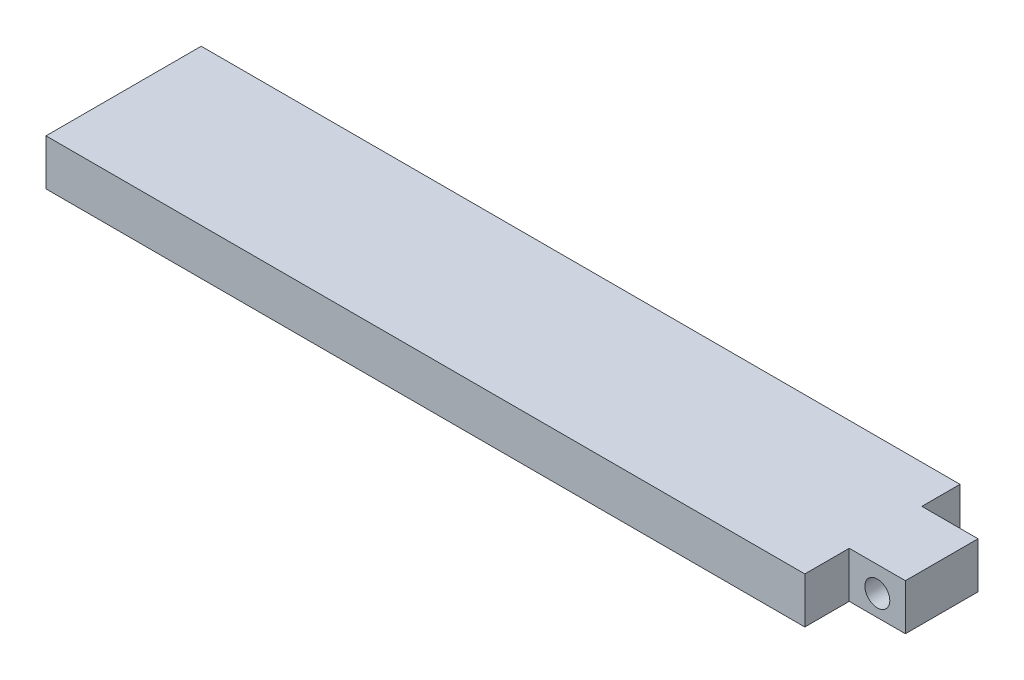
ISO-10303-21;
HEADER;
FILE_DESCRIPTION(('STEP AP214'),'2;1');
FILE_NAME('part.step','',(''),(''),'','','');
FILE_SCHEMA(('AUTOMOTIVE_DESIGN { 1 0 10303 214 1 1 1 1 }'));
ENDSEC;
DATA;
#1=APPLICATION_CONTEXT('core data for automotive mechanical design processes');
#2=APPLICATION_PROTOCOL_DEFINITION('international standard','automotive_design',2000,#1);
#3=PRODUCT_CONTEXT('',#1,'mechanical');
#4=PRODUCT('Part','Part','',(#3));
#5=PRODUCT_RELATED_PRODUCT_CATEGORY('part','',(#4));
#6=PRODUCT_DEFINITION_FORMATION('','',#4);
#7=PRODUCT_DEFINITION_CONTEXT('part definition',#1,'design');
#8=PRODUCT_DEFINITION('design','',#6,#7);
#9=PRODUCT_DEFINITION_SHAPE('','',#8);
#10=(LENGTH_UNIT() NAMED_UNIT(*) SI_UNIT(.MILLI.,.METRE.));
#11=(NAMED_UNIT(*) PLANE_ANGLE_UNIT() SI_UNIT($,.RADIAN.));
#12=(NAMED_UNIT(*) SI_UNIT($,.STERADIAN.) SOLID_ANGLE_UNIT());
#13=UNCERTAINTY_MEASURE_WITH_UNIT(LENGTH_MEASURE(1.E-05),#10,'distance_accuracy_value','');
#14=(GEOMETRIC_REPRESENTATION_CONTEXT(3) GLOBAL_UNCERTAINTY_ASSIGNED_CONTEXT((#13)) GLOBAL_UNIT_ASSIGNED_CONTEXT((#10,
#11,#12)) REPRESENTATION_CONTEXT('',''));
#15=CARTESIAN_POINT('',(0.,0.,0.));
#16=DIRECTION('',(0.,0.,1.));
#17=DIRECTION('',(1.,0.,0.));
#18=AXIS2_PLACEMENT_3D('',#15,#16,#17);
#19=CARTESIAN_POINT('',(0.,4.,-3.86426784554317));
#20=DIRECTION('',(0.,0.,-1.));
#21=DIRECTION('',(-1.,0.,0.));
#22=AXIS2_PLACEMENT_3D('',#19,#20,#21);
#23=PLANE('',#22);
#24=CARTESIAN_POINT('',(68.4348044581604,1.81723247665775,-3.86426784554317));
#25=DIRECTION('',(0.,0.,1.));
#26=DIRECTION('',(1.,0.,0.));
#27=AXIS2_PLACEMENT_3D('',#24,#25,#26);
#28=CIRCLE('',#27,1.08475397364903);
#29=CARTESIAN_POINT('',(69.5195584318094,1.81723247665775,-3.86426784554317));
#30=VERTEX_POINT('',#29);
#31=EDGE_CURVE('E179',#30,#30,#28,.T.);
#32=ORIENTED_EDGE('',*,*,#31,.F.);
#33=EDGE_LOOP('',(#32));
#34=FACE_BOUND('',#33,.T.);
#35=DIRECTION('',(1.,0.,0.));
#36=VECTOR('',#35,1.);
#37=CARTESIAN_POINT('',(0.,0.,-3.86426784554317));
#38=LINE('',#37,#36);
#39=CARTESIAN_POINT('',(65.9937267510031,0.,-3.86426784554317));
#40=VERTEX_POINT('',#39);
#41=CARTESIAN_POINT('',(70.8758821653177,0.,-3.86426784554317));
#42=VERTEX_POINT('',#41);
#43=EDGE_CURVE('E134',#40,#42,#38,.T.);
#44=ORIENTED_EDGE('',*,*,#43,.T.);
#45=DIRECTION('',(0.,-1.,0.));
#46=VECTOR('',#45,1.);
#47=CARTESIAN_POINT('',(70.8758821653177,4.,-3.86426784554317));
#48=LINE('',#47,#46);
#49=CARTESIAN_POINT('',(70.8758821653177,4.,-3.86426784554317));
#50=VERTEX_POINT('',#49);
#51=EDGE_CURVE('E11',#50,#42,#48,.T.);
#52=ORIENTED_EDGE('',*,*,#51,.F.);
#53=DIRECTION('',(1.,0.,0.));
#54=VECTOR('',#53,1.);
#55=CARTESIAN_POINT('',(0.,4.,-3.86426784554317));
#56=LINE('',#55,#54);
#57=CARTESIAN_POINT('',(65.9937267510031,4.,-3.86426784554317));
#58=VERTEX_POINT('',#57);
#59=EDGE_CURVE('E175',#58,#50,#56,.T.);
#60=ORIENTED_EDGE('',*,*,#59,.F.);
#61=DIRECTION('',(0.,-1.,0.));
#62=VECTOR('',#61,1.);
#63=CARTESIAN_POINT('',(65.9937267510031,4.,-3.86426784554317));
#64=LINE('',#63,#62);
#65=EDGE_CURVE('E52',#58,#40,#64,.T.);
#66=ORIENTED_EDGE('',*,*,#65,.T.);
#67=EDGE_LOOP('',(#44,#52,#60,#66));
#68=FACE_BOUND('',#67,.T.);
#69=ADVANCED_FACE('F35',(#34,#68),#23,.F.);
#70=CARTESIAN_POINT('',(70.8758821653177,4.,0.));
#71=DIRECTION('',(-1.,0.,0.));
#72=DIRECTION('',(0.,0.,1.));
#73=AXIS2_PLACEMENT_3D('',#70,#71,#72);
#74=PLANE('',#73);
#75=DIRECTION('',(0.,0.,-1.));
#76=VECTOR('',#75,1.);
#77=CARTESIAN_POINT('',(70.8758821653177,0.,0.));
#78=LINE('',#77,#76);
#79=CARTESIAN_POINT('',(70.8758821653177,0.,-10.1795813079235));
#80=VERTEX_POINT('',#79);
#81=EDGE_CURVE('E136',#42,#80,#78,.T.);
#82=ORIENTED_EDGE('',*,*,#81,.T.);
#83=DIRECTION('',(0.,-1.,0.));
#84=VECTOR('',#83,1.);
#85=CARTESIAN_POINT('',(70.8758821653177,4.,-10.1795813079235));
#86=LINE('',#85,#84);
#87=CARTESIAN_POINT('',(70.8758821653177,4.,-10.1795813079235));
#88=VERTEX_POINT('',#87);
#89=EDGE_CURVE('E44',#88,#80,#86,.T.);
#90=ORIENTED_EDGE('',*,*,#89,.F.);
#91=DIRECTION('',(0.,0.,-1.));
#92=VECTOR('',#91,1.);
#93=CARTESIAN_POINT('',(70.8758821653177,4.,0.));
#94=LINE('',#93,#92);
#95=EDGE_CURVE('E91',#50,#88,#94,.T.);
#96=ORIENTED_EDGE('',*,*,#95,.F.);
#97=ORIENTED_EDGE('',*,*,#51,.T.);
#98=EDGE_LOOP('',(#82,#90,#96,#97));
#99=FACE_BOUND('',#98,.T.);
#100=ADVANCED_FACE('F165',(#99),#74,.F.);
#101=CARTESIAN_POINT('',(0.,4.,-10.1795813079235));
#102=DIRECTION('',(0.,0.,-1.));
#103=DIRECTION('',(-1.,0.,0.));
#104=AXIS2_PLACEMENT_3D('',#101,#102,#103);
#105=PLANE('',#104);
#106=CARTESIAN_POINT('',(68.4348044581604,1.81723247665775,-10.1795813079235));
#107=DIRECTION('',(0.,0.,-1.));
#108=DIRECTION('',(-1.,0.,0.));
#109=AXIS2_PLACEMENT_3D('',#106,#107,#108);
#110=CIRCLE('',#109,1.08475397364903);
#111=CARTESIAN_POINT('',(67.3500504845114,1.81723247665775,-10.1795813079235));
#112=VERTEX_POINT('',#111);
#113=EDGE_CURVE('E38',#112,#112,#110,.T.);
#114=ORIENTED_EDGE('',*,*,#113,.F.);
#115=EDGE_LOOP('',(#114));
#116=FACE_BOUND('',#115,.T.);
#117=DIRECTION('',(1.,0.,0.));
#118=VECTOR('',#117,1.);
#119=CARTESIAN_POINT('',(0.,0.,-10.1795813079235));
#120=LINE('',#119,#118);
#121=CARTESIAN_POINT('',(65.9937267510031,0.,-10.1795813079235));
#122=VERTEX_POINT('',#121);
#123=EDGE_CURVE('E139',#122,#80,#120,.T.);
#124=ORIENTED_EDGE('',*,*,#123,.F.);
#125=DIRECTION('',(0.,-1.,0.));
#126=VECTOR('',#125,1.);
#127=CARTESIAN_POINT('',(65.9937267510031,4.,-10.1795813079235));
#128=LINE('',#127,#126);
#129=CARTESIAN_POINT('',(65.9937267510031,4.,-10.1795813079235));
#130=VERTEX_POINT('',#129);
#131=EDGE_CURVE('E157',#130,#122,#128,.T.);
#132=ORIENTED_EDGE('',*,*,#131,.F.);
#133=DIRECTION('',(1.,0.,0.));
#134=VECTOR('',#133,1.);
#135=CARTESIAN_POINT('',(0.,4.,-10.1795813079235));
#136=LINE('',#135,#134);
#137=EDGE_CURVE('E164',#130,#88,#136,.T.);
#138=ORIENTED_EDGE('',*,*,#137,.T.);
#139=ORIENTED_EDGE('',*,*,#89,.T.);
#140=EDGE_LOOP('',(#124,#132,#138,#139));
#141=FACE_BOUND('',#140,.T.);
#142=ADVANCED_FACE('F162',(#116,#141),#105,.T.);
#143=CARTESIAN_POINT('',(65.9937267510031,4.,0.));
#144=DIRECTION('',(1.,0.,0.));
#145=DIRECTION('',(0.,0.,-1.));
#146=AXIS2_PLACEMENT_3D('',#143,#144,#145);
#147=PLANE('',#146);
#148=DIRECTION('',(0.,0.,1.));
#149=VECTOR('',#148,1.);
#150=CARTESIAN_POINT('',(65.9937267510031,0.,0.));
#151=LINE('',#150,#149);
#152=CARTESIAN_POINT('',(65.9937267510031,0.,-13.498100823404));
#153=VERTEX_POINT('',#152);
#154=EDGE_CURVE('E142',#153,#122,#151,.T.);
#155=ORIENTED_EDGE('',*,*,#154,.F.);
#156=DIRECTION('',(0.,-1.,0.));
#157=VECTOR('',#156,1.);
#158=CARTESIAN_POINT('',(65.9937267510031,4.,-13.498100823404));
#159=LINE('',#158,#157);
#160=CARTESIAN_POINT('',(65.9937267510031,4.,-13.498100823404));
#161=VERTEX_POINT('',#160);
#162=EDGE_CURVE('E155',#161,#153,#159,.T.);
#163=ORIENTED_EDGE('',*,*,#162,.F.);
#164=DIRECTION('',(0.,0.,1.));
#165=VECTOR('',#164,1.);
#166=CARTESIAN_POINT('',(65.9937267510031,4.,0.));
#167=LINE('',#166,#165);
#168=EDGE_CURVE('E130',#161,#130,#167,.T.);
#169=ORIENTED_EDGE('',*,*,#168,.T.);
#170=ORIENTED_EDGE('',*,*,#131,.T.);
#171=EDGE_LOOP('',(#155,#163,#169,#170));
#172=FACE_BOUND('',#171,.T.);
#173=ADVANCED_FACE('F172',(#172),#147,.T.);
#174=CARTESIAN_POINT('',(0.,4.,-13.498100823404));
#175=DIRECTION('',(0.,0.,-1.));
#176=DIRECTION('',(-1.,0.,0.));
#177=AXIS2_PLACEMENT_3D('',#174,#175,#176);
#178=PLANE('',#177);
#179=DIRECTION('',(1.,0.,0.));
#180=VECTOR('',#179,1.);
#181=CARTESIAN_POINT('',(0.,0.,-13.498100823404));
#182=LINE('',#181,#180);
#183=CARTESIAN_POINT('',(0.,0.,-13.498100823404));
#184=VERTEX_POINT('',#183);
#185=EDGE_CURVE('E145',#184,#153,#182,.T.);
#186=ORIENTED_EDGE('',*,*,#185,.F.);
#187=DIRECTION('',(0.,-1.,0.));
#188=VECTOR('',#187,1.);
#189=CARTESIAN_POINT('',(0.,4.,-13.498100823404));
#190=LINE('',#189,#188);
#191=CARTESIAN_POINT('',(0.,4.,-13.498100823404));
#192=VERTEX_POINT('',#191);
#193=EDGE_CURVE('E116',#192,#184,#190,.T.);
#194=ORIENTED_EDGE('',*,*,#193,.F.);
#195=DIRECTION('',(1.,0.,0.));
#196=VECTOR('',#195,1.);
#197=CARTESIAN_POINT('',(0.,4.,-13.498100823404));
#198=LINE('',#197,#196);
#199=EDGE_CURVE('E128',#192,#161,#198,.T.);
#200=ORIENTED_EDGE('',*,*,#199,.T.);
#201=ORIENTED_EDGE('',*,*,#162,.T.);
#202=EDGE_LOOP('',(#186,#194,#200,#201));
#203=FACE_BOUND('',#202,.T.);
#204=ADVANCED_FACE('F194',(#203),#178,.T.);
#205=CARTESIAN_POINT('',(0.,4.,0.));
#206=DIRECTION('',(-1.,0.,0.));
#207=DIRECTION('',(0.,0.,1.));
#208=AXIS2_PLACEMENT_3D('',#205,#206,#207);
#209=PLANE('',#208);
#210=DIRECTION('',(0.,0.,-1.));
#211=VECTOR('',#210,1.);
#212=CARTESIAN_POINT('',(0.,0.,0.));
#213=LINE('',#212,#211);
#214=CARTESIAN_POINT('',(0.,0.,0.));
#215=VERTEX_POINT('',#214);
#216=EDGE_CURVE('E113',#215,#184,#213,.T.);
#217=ORIENTED_EDGE('',*,*,#216,.F.);
#218=DIRECTION('',(0.,-1.,0.));
#219=VECTOR('',#218,1.);
#220=CARTESIAN_POINT('',(0.,4.,0.));
#221=LINE('',#220,#219);
#222=CARTESIAN_POINT('',(0.,4.,0.));
#223=VERTEX_POINT('',#222);
#224=EDGE_CURVE('E107',#223,#215,#221,.T.);
#225=ORIENTED_EDGE('',*,*,#224,.F.);
#226=DIRECTION('',(0.,0.,-1.));
#227=VECTOR('',#226,1.);
#228=CARTESIAN_POINT('',(0.,4.,0.));
#229=LINE('',#228,#227);
#230=EDGE_CURVE('E111',#223,#192,#229,.T.);
#231=ORIENTED_EDGE('',*,*,#230,.T.);
#232=ORIENTED_EDGE('',*,*,#193,.T.);
#233=EDGE_LOOP('',(#217,#225,#231,#232));
#234=FACE_BOUND('',#233,.T.);
#235=ADVANCED_FACE('F109',(#234),#209,.T.);
#236=CARTESIAN_POINT('',(0.,4.,0.));
#237=DIRECTION('',(0.,0.,-1.));
#238=DIRECTION('',(-1.,0.,0.));
#239=AXIS2_PLACEMENT_3D('',#236,#237,#238);
#240=PLANE('',#239);
#241=DIRECTION('',(1.,0.,0.));
#242=VECTOR('',#241,1.);
#243=CARTESIAN_POINT('',(0.,0.,0.));
#244=LINE('',#243,#242);
#245=CARTESIAN_POINT('',(65.9937267510031,0.,0.));
#246=VERTEX_POINT('',#245);
#247=EDGE_CURVE('E150',#215,#246,#244,.T.);
#248=ORIENTED_EDGE('',*,*,#247,.T.);
#249=DIRECTION('',(0.,-1.,0.));
#250=VECTOR('',#249,1.);
#251=CARTESIAN_POINT('',(65.9937267510031,4.,0.));
#252=LINE('',#251,#250);
#253=CARTESIAN_POINT('',(65.9937267510031,4.,0.));
#254=VERTEX_POINT('',#253);
#255=EDGE_CURVE('E79',#254,#246,#252,.T.);
#256=ORIENTED_EDGE('',*,*,#255,.F.);
#257=DIRECTION('',(1.,0.,0.));
#258=VECTOR('',#257,1.);
#259=CARTESIAN_POINT('',(0.,4.,0.));
#260=LINE('',#259,#258);
#261=EDGE_CURVE('E118',#223,#254,#260,.T.);
#262=ORIENTED_EDGE('',*,*,#261,.F.);
#263=ORIENTED_EDGE('',*,*,#224,.T.);
#264=EDGE_LOOP('',(#248,#256,#262,#263));
#265=FACE_BOUND('',#264,.T.);
#266=ADVANCED_FACE('F119',(#265),#240,.F.);
#267=EDGE_CURVE('E146',#40,#246,#151,.T.);
#268=ORIENTED_EDGE('',*,*,#267,.F.);
#269=ORIENTED_EDGE('',*,*,#65,.F.);
#270=EDGE_CURVE('E122',#58,#254,#167,.T.);
#271=ORIENTED_EDGE('',*,*,#270,.T.);
#272=ORIENTED_EDGE('',*,*,#255,.T.);
#273=EDGE_LOOP('',(#268,#269,#271,#272));
#274=FACE_BOUND('',#273,.T.);
#275=ADVANCED_FACE('F196',(#274),#147,.T.);
#276=CARTESIAN_POINT('',(0.,4.,0.));
#277=DIRECTION('',(0.,1.,0.));
#278=DIRECTION('',(0.,0.,1.));
#279=AXIS2_PLACEMENT_3D('',#276,#277,#278);
#280=PLANE('',#279);
#281=ORIENTED_EDGE('',*,*,#59,.T.);
#282=ORIENTED_EDGE('',*,*,#95,.T.);
#283=ORIENTED_EDGE('',*,*,#137,.F.);
#284=ORIENTED_EDGE('',*,*,#168,.F.);
#285=ORIENTED_EDGE('',*,*,#199,.F.);
#286=ORIENTED_EDGE('',*,*,#230,.F.);
#287=ORIENTED_EDGE('',*,*,#261,.T.);
#288=ORIENTED_EDGE('',*,*,#270,.F.);
#289=EDGE_LOOP('',(#281,#282,#283,#284,#285,#286,#287,#288));
#290=FACE_BOUND('',#289,.T.);
#291=ADVANCED_FACE('F125',(#290),#280,.T.);
#292=CARTESIAN_POINT('',(0.,0.,0.));
#293=DIRECTION('',(0.,1.,0.));
#294=DIRECTION('',(0.,0.,1.));
#295=AXIS2_PLACEMENT_3D('',#292,#293,#294);
#296=PLANE('',#295);
#297=ORIENTED_EDGE('',*,*,#43,.F.);
#298=ORIENTED_EDGE('',*,*,#267,.T.);
#299=ORIENTED_EDGE('',*,*,#247,.F.);
#300=ORIENTED_EDGE('',*,*,#216,.T.);
#301=ORIENTED_EDGE('',*,*,#185,.T.);
#302=ORIENTED_EDGE('',*,*,#154,.T.);
#303=ORIENTED_EDGE('',*,*,#123,.T.);
#304=ORIENTED_EDGE('',*,*,#81,.F.);
#305=EDGE_LOOP('',(#297,#298,#299,#300,#301,#302,#303,#304));
#306=FACE_BOUND('',#305,.T.);
#307=ADVANCED_FACE('F168',(#306),#296,.F.);
#308=CARTESIAN_POINT('',(68.4348044581604,1.81723247665775,-13.498100823404));
#309=DIRECTION('',(0.,0.,1.));
#310=DIRECTION('',(1.,0.,0.));
#311=AXIS2_PLACEMENT_3D('',#308,#309,#310);
#312=CYLINDRICAL_SURFACE('',#311,1.08475397364903);
#313=ORIENTED_EDGE('',*,*,#113,.T.);
#314=EDGE_LOOP('',(#313));
#315=FACE_BOUND('',#314,.T.);
#316=ORIENTED_EDGE('',*,*,#31,.T.);
#317=EDGE_LOOP('',(#316));
#318=FACE_BOUND('',#317,.T.);
#319=ADVANCED_FACE('F186',(#315,#318),#312,.F.);
#320=CLOSED_SHELL('',(#69,#100,#142,#173,#204,#235,#266,#275,#291,#307,#319));
#321=MANIFOLD_SOLID_BREP('B2',#320);
#322=ADVANCED_BREP_SHAPE_REPRESENTATION('',(#18,#321),#14);
#323=SHAPE_DEFINITION_REPRESENTATION(#9,#322);
ENDSEC;
END-ISO-10303-21;
